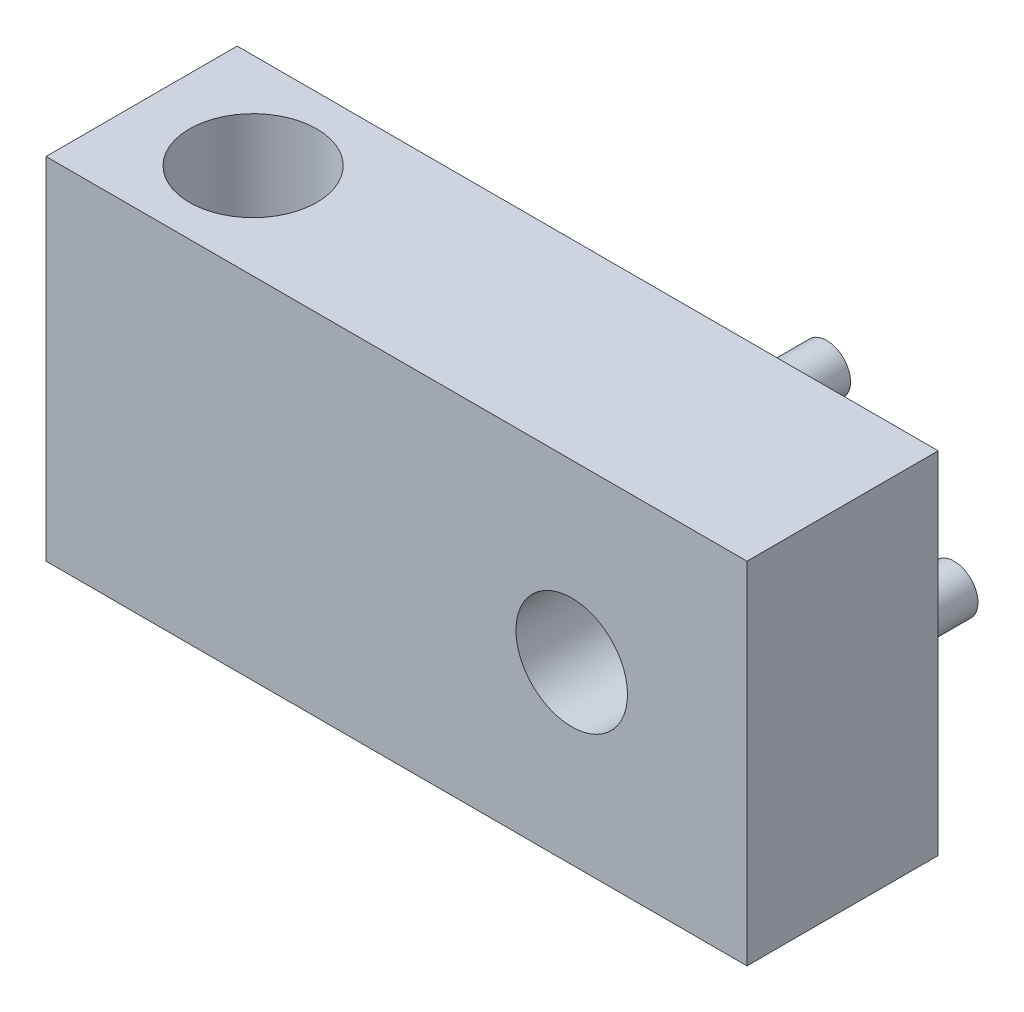
ISO-10303-21;
HEADER;
FILE_DESCRIPTION(('STEP AP214'),'2;1');
FILE_NAME('part.step','',(''),(''),'','','');
FILE_SCHEMA(('AUTOMOTIVE_DESIGN { 1 0 10303 214 1 1 1 1 }'));
ENDSEC;
DATA;
#1=APPLICATION_CONTEXT('core data for automotive mechanical design processes');
#2=APPLICATION_PROTOCOL_DEFINITION('international standard','automotive_design',2000,#1);
#3=PRODUCT_CONTEXT('',#1,'mechanical');
#4=PRODUCT('Part','Part','',(#3));
#5=PRODUCT_RELATED_PRODUCT_CATEGORY('part','',(#4));
#6=PRODUCT_DEFINITION_FORMATION('','',#4);
#7=PRODUCT_DEFINITION_CONTEXT('part definition',#1,'design');
#8=PRODUCT_DEFINITION('design','',#6,#7);
#9=PRODUCT_DEFINITION_SHAPE('','',#8);
#10=(LENGTH_UNIT() NAMED_UNIT(*) SI_UNIT(.MILLI.,.METRE.));
#11=(NAMED_UNIT(*) PLANE_ANGLE_UNIT() SI_UNIT($,.RADIAN.));
#12=(NAMED_UNIT(*) SI_UNIT($,.STERADIAN.) SOLID_ANGLE_UNIT());
#13=UNCERTAINTY_MEASURE_WITH_UNIT(LENGTH_MEASURE(1.E-05),#10,'distance_accuracy_value','');
#14=(GEOMETRIC_REPRESENTATION_CONTEXT(3) GLOBAL_UNCERTAINTY_ASSIGNED_CONTEXT((#13)) GLOBAL_UNIT_ASSIGNED_CONTEXT((#10,
#11,#12)) REPRESENTATION_CONTEXT('',''));
#15=CARTESIAN_POINT('',(0.,0.,0.));
#16=DIRECTION('',(0.,0.,1.));
#17=DIRECTION('',(1.,0.,0.));
#18=AXIS2_PLACEMENT_3D('',#15,#16,#17);
#19=CARTESIAN_POINT('',(11.,11.,12.));
#20=DIRECTION('',(-1.,0.,0.));
#21=DIRECTION('',(0.,-1.,0.));
#22=AXIS2_PLACEMENT_3D('',#19,#20,#21);
#23=PLANE('',#22);
#24=DIRECTION('',(0.,1.,0.));
#25=VECTOR('',#24,1.);
#26=CARTESIAN_POINT('',(11.,11.,0.));
#27=LINE('',#26,#25);
#28=CARTESIAN_POINT('',(11.,-11.,0.));
#29=VERTEX_POINT('',#28);
#30=CARTESIAN_POINT('',(11.,11.,0.));
#31=VERTEX_POINT('',#30);
#32=EDGE_CURVE('E85',#29,#31,#27,.T.);
#33=ORIENTED_EDGE('',*,*,#32,.T.);
#34=DIRECTION('',(0.,0.,-1.));
#35=VECTOR('',#34,1.);
#36=CARTESIAN_POINT('',(11.,11.,12.));
#37=LINE('',#36,#35);
#38=CARTESIAN_POINT('',(11.,11.,12.));
#39=VERTEX_POINT('',#38);
#40=EDGE_CURVE('E82',#39,#31,#37,.T.);
#41=ORIENTED_EDGE('',*,*,#40,.F.);
#42=DIRECTION('',(0.,1.,0.));
#43=VECTOR('',#42,1.);
#44=CARTESIAN_POINT('',(11.,11.,12.));
#45=LINE('',#44,#43);
#46=CARTESIAN_POINT('',(11.,-11.,12.));
#47=VERTEX_POINT('',#46);
#48=EDGE_CURVE('E124',#47,#39,#45,.T.);
#49=ORIENTED_EDGE('',*,*,#48,.F.);
#50=DIRECTION('',(0.,0.,-1.));
#51=VECTOR('',#50,1.);
#52=CARTESIAN_POINT('',(11.,-11.,12.));
#53=LINE('',#52,#51);
#54=EDGE_CURVE('E128',#47,#29,#53,.T.);
#55=ORIENTED_EDGE('',*,*,#54,.T.);
#56=EDGE_LOOP('',(#33,#41,#49,#55));
#57=FACE_BOUND('',#56,.T.);
#58=ADVANCED_FACE('F35',(#57),#23,.F.);
#59=CARTESIAN_POINT('',(-11.,11.,12.));
#60=DIRECTION('',(0.,-1.,0.));
#61=DIRECTION('',(0.,0.,-1.));
#62=AXIS2_PLACEMENT_3D('',#59,#60,#61);
#63=PLANE('',#62);
#64=CARTESIAN_POINT('',(-26.,11.,6.));
#65=DIRECTION('',(0.,-1.,0.));
#66=DIRECTION('',(0.,0.,-1.));
#67=AXIS2_PLACEMENT_3D('',#64,#65,#66);
#68=CIRCLE('',#67,4.);
#69=CARTESIAN_POINT('',(-26.,11.,2.));
#70=VERTEX_POINT('',#69);
#71=EDGE_CURVE('E97',#70,#70,#68,.T.);
#72=ORIENTED_EDGE('',*,*,#71,.T.);
#73=EDGE_LOOP('',(#72));
#74=FACE_BOUND('',#73,.T.);
#75=DIRECTION('',(-1.,0.,0.));
#76=VECTOR('',#75,1.);
#77=CARTESIAN_POINT('',(-11.,11.,0.));
#78=LINE('',#77,#76);
#79=CARTESIAN_POINT('',(-33.,11.,0.));
#80=VERTEX_POINT('',#79);
#81=EDGE_CURVE('E63',#31,#80,#78,.T.);
#82=ORIENTED_EDGE('',*,*,#81,.T.);
#83=DIRECTION('',(0.,0.,-1.));
#84=VECTOR('',#83,1.);
#85=CARTESIAN_POINT('',(-33.,11.,12.));
#86=LINE('',#85,#84);
#87=CARTESIAN_POINT('',(-33.,11.,12.));
#88=VERTEX_POINT('',#87);
#89=EDGE_CURVE('E80',#88,#80,#86,.T.);
#90=ORIENTED_EDGE('',*,*,#89,.F.);
#91=DIRECTION('',(-1.,0.,0.));
#92=VECTOR('',#91,1.);
#93=CARTESIAN_POINT('',(-11.,11.,12.));
#94=LINE('',#93,#92);
#95=EDGE_CURVE('E68',#39,#88,#94,.T.);
#96=ORIENTED_EDGE('',*,*,#95,.F.);
#97=ORIENTED_EDGE('',*,*,#40,.T.);
#98=EDGE_LOOP('',(#82,#90,#96,#97));
#99=FACE_BOUND('',#98,.T.);
#100=ADVANCED_FACE('F78',(#74,#99),#63,.F.);
#101=CARTESIAN_POINT('',(-11.,-11.,12.));
#102=DIRECTION('',(0.,1.,0.));
#103=DIRECTION('',(0.,0.,1.));
#104=AXIS2_PLACEMENT_3D('',#101,#102,#103);
#105=PLANE('',#104);
#106=CARTESIAN_POINT('',(-26.,-11.,6.));
#107=DIRECTION('',(0.,-1.,0.));
#108=DIRECTION('',(0.,0.,-1.));
#109=AXIS2_PLACEMENT_3D('',#106,#107,#108);
#110=CIRCLE('',#109,4.);
#111=CARTESIAN_POINT('',(-26.,-11.,2.));
#112=VERTEX_POINT('',#111);
#113=EDGE_CURVE('E100',#112,#112,#110,.T.);
#114=ORIENTED_EDGE('',*,*,#113,.F.);
#115=EDGE_LOOP('',(#114));
#116=FACE_BOUND('',#115,.T.);
#117=DIRECTION('',(1.,0.,0.));
#118=VECTOR('',#117,1.);
#119=CARTESIAN_POINT('',(-11.,-11.,0.));
#120=LINE('',#119,#118);
#121=CARTESIAN_POINT('',(-33.,-11.,0.));
#122=VERTEX_POINT('',#121);
#123=EDGE_CURVE('E84',#122,#29,#120,.T.);
#124=ORIENTED_EDGE('',*,*,#123,.T.);
#125=ORIENTED_EDGE('',*,*,#54,.F.);
#126=DIRECTION('',(1.,0.,0.));
#127=VECTOR('',#126,1.);
#128=CARTESIAN_POINT('',(-11.,-11.,12.));
#129=LINE('',#128,#127);
#130=CARTESIAN_POINT('',(-33.,-11.,12.));
#131=VERTEX_POINT('',#130);
#132=EDGE_CURVE('E51',#131,#47,#129,.T.);
#133=ORIENTED_EDGE('',*,*,#132,.F.);
#134=DIRECTION('',(0.,0.,1.));
#135=VECTOR('',#134,1.);
#136=CARTESIAN_POINT('',(-33.,-11.,0.));
#137=LINE('',#136,#135);
#138=EDGE_CURVE('E93',#122,#131,#137,.T.);
#139=ORIENTED_EDGE('',*,*,#138,.F.);
#140=EDGE_LOOP('',(#124,#125,#133,#139));
#141=FACE_BOUND('',#140,.T.);
#142=ADVANCED_FACE('F163',(#116,#141),#105,.F.);
#143=CARTESIAN_POINT('',(0.,0.,12.));
#144=DIRECTION('',(0.,0.,1.));
#145=DIRECTION('',(1.,0.,0.));
#146=AXIS2_PLACEMENT_3D('',#143,#144,#145);
#147=PLANE('',#146);
#148=CARTESIAN_POINT('',(0.,0.,12.));
#149=DIRECTION('',(0.,0.,1.));
#150=DIRECTION('',(1.,0.,0.));
#151=AXIS2_PLACEMENT_3D('',#148,#149,#150);
#152=CIRCLE('',#151,3.5);
#153=CARTESIAN_POINT('',(3.5,0.,12.));
#154=VERTEX_POINT('',#153);
#155=EDGE_CURVE('E118',#154,#154,#152,.T.);
#156=ORIENTED_EDGE('',*,*,#155,.F.);
#157=EDGE_LOOP('',(#156));
#158=FACE_BOUND('',#157,.T.);
#159=ORIENTED_EDGE('',*,*,#48,.T.);
#160=ORIENTED_EDGE('',*,*,#95,.T.);
#161=DIRECTION('',(0.,1.,0.));
#162=VECTOR('',#161,1.);
#163=CARTESIAN_POINT('',(-33.,-11.,12.));
#164=LINE('',#163,#162);
#165=EDGE_CURVE('E96',#131,#88,#164,.T.);
#166=ORIENTED_EDGE('',*,*,#165,.F.);
#167=ORIENTED_EDGE('',*,*,#132,.T.);
#168=EDGE_LOOP('',(#159,#160,#166,#167));
#169=FACE_BOUND('',#168,.T.);
#170=ADVANCED_FACE('F147',(#158,#169),#147,.T.);
#171=CARTESIAN_POINT('',(0.,0.,0.));
#172=DIRECTION('',(0.,0.,1.));
#173=DIRECTION('',(1.,0.,0.));
#174=AXIS2_PLACEMENT_3D('',#171,#172,#173);
#175=PLANE('',#174);
#176=CARTESIAN_POINT('',(7.99999999999977,-2.27373675443232E-13,0.));
#177=DIRECTION('',(0.,0.,1.));
#178=DIRECTION('',(1.,0.,0.));
#179=AXIS2_PLACEMENT_3D('',#176,#177,#178);
#180=CIRCLE('',#179,1.50000000000036);
#181=CARTESIAN_POINT('',(9.50000000000014,-2.27373675443232E-13,0.));
#182=VERTEX_POINT('',#181);
#183=EDGE_CURVE('E11',#182,#182,#180,.F.);
#184=ORIENTED_EDGE('',*,*,#183,.F.);
#185=EDGE_LOOP('',(#184));
#186=FACE_BOUND('',#185,.T.);
#187=CARTESIAN_POINT('',(-4.52787916007828E-13,-8.,0.));
#188=DIRECTION('',(0.,0.,1.));
#189=DIRECTION('',(1.,0.,0.));
#190=AXIS2_PLACEMENT_3D('',#187,#188,#189);
#191=CIRCLE('',#190,1.50000000000049);
#192=CARTESIAN_POINT('',(1.50000000000003,-8.,0.));
#193=VERTEX_POINT('',#192);
#194=EDGE_CURVE('E43',#193,#193,#191,.F.);
#195=ORIENTED_EDGE('',*,*,#194,.F.);
#196=EDGE_LOOP('',(#195));
#197=FACE_BOUND('',#196,.T.);
#198=CARTESIAN_POINT('',(-8.00000000000023,2.26393958003914E-13,0.));
#199=DIRECTION('',(0.,0.,1.));
#200=DIRECTION('',(1.,0.,0.));
#201=AXIS2_PLACEMENT_3D('',#198,#199,#200);
#202=CIRCLE('',#201,1.50000000000018);
#203=CARTESIAN_POINT('',(-6.50000000000005,2.26393958003914E-13,0.));
#204=VERTEX_POINT('',#203);
#205=EDGE_CURVE('E137',#204,#204,#202,.F.);
#206=ORIENTED_EDGE('',*,*,#205,.F.);
#207=EDGE_LOOP('',(#206));
#208=FACE_BOUND('',#207,.T.);
#209=CARTESIAN_POINT('',(0.,8.,0.));
#210=DIRECTION('',(0.,0.,1.));
#211=DIRECTION('',(1.,0.,0.));
#212=AXIS2_PLACEMENT_3D('',#209,#210,#211);
#213=CIRCLE('',#212,1.5);
#214=CARTESIAN_POINT('',(1.5,8.,0.));
#215=VERTEX_POINT('',#214);
#216=EDGE_CURVE('E134',#215,#215,#213,.F.);
#217=ORIENTED_EDGE('',*,*,#216,.F.);
#218=EDGE_LOOP('',(#217));
#219=FACE_BOUND('',#218,.T.);
#220=CARTESIAN_POINT('',(0.,0.,0.));
#221=DIRECTION('',(0.,0.,1.));
#222=DIRECTION('',(1.,0.,0.));
#223=AXIS2_PLACEMENT_3D('',#220,#221,#222);
#224=CIRCLE('',#223,3.5);
#225=CARTESIAN_POINT('',(3.5,0.,0.));
#226=VERTEX_POINT('',#225);
#227=EDGE_CURVE('E119',#226,#226,#224,.T.);
#228=ORIENTED_EDGE('',*,*,#227,.T.);
#229=EDGE_LOOP('',(#228));
#230=FACE_BOUND('',#229,.T.);
#231=ORIENTED_EDGE('',*,*,#32,.F.);
#232=ORIENTED_EDGE('',*,*,#123,.F.);
#233=DIRECTION('',(0.,-1.,0.));
#234=VECTOR('',#233,1.);
#235=CARTESIAN_POINT('',(-33.,11.,0.));
#236=LINE('',#235,#234);
#237=EDGE_CURVE('E88',#80,#122,#236,.T.);
#238=ORIENTED_EDGE('',*,*,#237,.F.);
#239=ORIENTED_EDGE('',*,*,#81,.F.);
#240=EDGE_LOOP('',(#231,#232,#238,#239));
#241=FACE_BOUND('',#240,.T.);
#242=ADVANCED_FACE('F89',(#186,#197,#208,#219,#230,#241),#175,.F.);
#243=CARTESIAN_POINT('',(0.,0.,0.));
#244=DIRECTION('',(0.,0.,1.));
#245=DIRECTION('',(1.,0.,0.));
#246=AXIS2_PLACEMENT_3D('',#243,#244,#245);
#247=CYLINDRICAL_SURFACE('',#246,3.5);
#248=ORIENTED_EDGE('',*,*,#227,.F.);
#249=EDGE_LOOP('',(#248));
#250=FACE_BOUND('',#249,.T.);
#251=ORIENTED_EDGE('',*,*,#155,.T.);
#252=EDGE_LOOP('',(#251));
#253=FACE_BOUND('',#252,.T.);
#254=ADVANCED_FACE('F146',(#250,#253),#247,.F.);
#255=CARTESIAN_POINT('',(0.,8.,-4.));
#256=DIRECTION('',(0.,0.,1.));
#257=DIRECTION('',(1.,0.,0.));
#258=AXIS2_PLACEMENT_3D('',#255,#256,#257);
#259=CYLINDRICAL_SURFACE('',#258,1.5);
#260=CARTESIAN_POINT('',(0.,8.,-4.));
#261=DIRECTION('',(0.,0.,-1.));
#262=DIRECTION('',(-1.,0.,0.));
#263=AXIS2_PLACEMENT_3D('',#260,#261,#262);
#264=CIRCLE('',#263,1.5);
#265=CARTESIAN_POINT('',(-1.5,8.,-4.));
#266=VERTEX_POINT('',#265);
#267=EDGE_CURVE('E115',#266,#266,#264,.T.);
#268=ORIENTED_EDGE('',*,*,#267,.F.);
#269=EDGE_LOOP('',(#268));
#270=FACE_BOUND('',#269,.T.);
#271=ORIENTED_EDGE('',*,*,#216,.T.);
#272=EDGE_LOOP('',(#271));
#273=FACE_BOUND('',#272,.T.);
#274=ADVANCED_FACE('F158',(#270,#273),#259,.T.);
#275=CARTESIAN_POINT('',(0.,8.,-4.));
#276=DIRECTION('',(0.,0.,-1.));
#277=DIRECTION('',(-1.,0.,0.));
#278=AXIS2_PLACEMENT_3D('',#275,#276,#277);
#279=PLANE('',#278);
#280=ORIENTED_EDGE('',*,*,#267,.T.);
#281=EDGE_LOOP('',(#280));
#282=FACE_BOUND('',#281,.T.);
#283=ADVANCED_FACE('F257',(#282),#279,.T.);
#284=CARTESIAN_POINT('',(-8.00000000000023,2.26393958003914E-13,-4.));
#285=DIRECTION('',(0.,0.,1.));
#286=DIRECTION('',(1.,0.,0.));
#287=AXIS2_PLACEMENT_3D('',#284,#285,#286);
#288=CYLINDRICAL_SURFACE('',#287,1.50000000000018);
#289=CARTESIAN_POINT('',(-8.00000000000023,2.26393958003914E-13,-4.));
#290=DIRECTION('',(0.,0.,-1.));
#291=DIRECTION('',(-1.,0.,0.));
#292=AXIS2_PLACEMENT_3D('',#289,#290,#291);
#293=CIRCLE('',#292,1.50000000000018);
#294=CARTESIAN_POINT('',(-9.5000000000004,2.26393958003914E-13,-4.));
#295=VERTEX_POINT('',#294);
#296=EDGE_CURVE('E112',#295,#295,#293,.T.);
#297=ORIENTED_EDGE('',*,*,#296,.F.);
#298=EDGE_LOOP('',(#297));
#299=FACE_BOUND('',#298,.T.);
#300=ORIENTED_EDGE('',*,*,#205,.T.);
#301=EDGE_LOOP('',(#300));
#302=FACE_BOUND('',#301,.T.);
#303=ADVANCED_FACE('F249',(#299,#302),#288,.T.);
#304=CARTESIAN_POINT('',(-8.00000000000023,2.26393958003914E-13,-4.));
#305=DIRECTION('',(0.,0.,-1.));
#306=DIRECTION('',(-1.,0.,0.));
#307=AXIS2_PLACEMENT_3D('',#304,#305,#306);
#308=PLANE('',#307);
#309=ORIENTED_EDGE('',*,*,#296,.T.);
#310=EDGE_LOOP('',(#309));
#311=FACE_BOUND('',#310,.T.);
#312=ADVANCED_FACE('F241',(#311),#308,.T.);
#313=CARTESIAN_POINT('',(-4.52787916007828E-13,-8.,-4.));
#314=DIRECTION('',(0.,0.,1.));
#315=DIRECTION('',(1.,0.,0.));
#316=AXIS2_PLACEMENT_3D('',#313,#314,#315);
#317=CYLINDRICAL_SURFACE('',#316,1.50000000000049);
#318=CARTESIAN_POINT('',(-4.52787916007828E-13,-8.,-4.));
#319=DIRECTION('',(0.,0.,-1.));
#320=DIRECTION('',(-1.,0.,0.));
#321=AXIS2_PLACEMENT_3D('',#318,#319,#320);
#322=CIRCLE('',#321,1.50000000000049);
#323=CARTESIAN_POINT('',(-1.50000000000094,-8.,-4.));
#324=VERTEX_POINT('',#323);
#325=EDGE_CURVE('E109',#324,#324,#322,.T.);
#326=ORIENTED_EDGE('',*,*,#325,.F.);
#327=EDGE_LOOP('',(#326));
#328=FACE_BOUND('',#327,.T.);
#329=ORIENTED_EDGE('',*,*,#194,.T.);
#330=EDGE_LOOP('',(#329));
#331=FACE_BOUND('',#330,.T.);
#332=ADVANCED_FACE('F142',(#328,#331),#317,.T.);
#333=CARTESIAN_POINT('',(-4.52787916007828E-13,-8.,-4.));
#334=DIRECTION('',(0.,0.,-1.));
#335=DIRECTION('',(-1.,0.,0.));
#336=AXIS2_PLACEMENT_3D('',#333,#334,#335);
#337=PLANE('',#336);
#338=ORIENTED_EDGE('',*,*,#325,.T.);
#339=EDGE_LOOP('',(#338));
#340=FACE_BOUND('',#339,.T.);
#341=ADVANCED_FACE('F226',(#340),#337,.T.);
#342=CARTESIAN_POINT('',(7.99999999999977,-2.27373675443232E-13,-4.));
#343=DIRECTION('',(0.,0.,1.));
#344=DIRECTION('',(1.,0.,0.));
#345=AXIS2_PLACEMENT_3D('',#342,#343,#344);
#346=CYLINDRICAL_SURFACE('',#345,1.50000000000036);
#347=CARTESIAN_POINT('',(7.99999999999977,-2.27373675443232E-13,-4.));
#348=DIRECTION('',(0.,0.,-1.));
#349=DIRECTION('',(-1.,0.,0.));
#350=AXIS2_PLACEMENT_3D('',#347,#348,#349);
#351=CIRCLE('',#350,1.50000000000036);
#352=CARTESIAN_POINT('',(6.49999999999941,-2.27373675443232E-13,-4.));
#353=VERTEX_POINT('',#352);
#354=EDGE_CURVE('E106',#353,#353,#351,.T.);
#355=ORIENTED_EDGE('',*,*,#354,.F.);
#356=EDGE_LOOP('',(#355));
#357=FACE_BOUND('',#356,.T.);
#358=ORIENTED_EDGE('',*,*,#183,.T.);
#359=EDGE_LOOP('',(#358));
#360=FACE_BOUND('',#359,.T.);
#361=ADVANCED_FACE('F218',(#357,#360),#346,.T.);
#362=CARTESIAN_POINT('',(7.99999999999977,-2.27373675443232E-13,-4.));
#363=DIRECTION('',(0.,0.,-1.));
#364=DIRECTION('',(-1.,0.,0.));
#365=AXIS2_PLACEMENT_3D('',#362,#363,#364);
#366=PLANE('',#365);
#367=ORIENTED_EDGE('',*,*,#354,.T.);
#368=EDGE_LOOP('',(#367));
#369=FACE_BOUND('',#368,.T.);
#370=ADVANCED_FACE('F213',(#369),#366,.T.);
#371=CARTESIAN_POINT('',(-33.,0.,0.));
#372=DIRECTION('',(-1.,0.,0.));
#373=DIRECTION('',(0.,-1.,0.));
#374=AXIS2_PLACEMENT_3D('',#371,#372,#373);
#375=PLANE('',#374);
#376=ORIENTED_EDGE('',*,*,#89,.T.);
#377=ORIENTED_EDGE('',*,*,#237,.T.);
#378=ORIENTED_EDGE('',*,*,#138,.T.);
#379=ORIENTED_EDGE('',*,*,#165,.T.);
#380=EDGE_LOOP('',(#376,#377,#378,#379));
#381=FACE_BOUND('',#380,.T.);
#382=ADVANCED_FACE('F95',(#381),#375,.T.);
#383=CARTESIAN_POINT('',(-26.,11.,6.));
#384=DIRECTION('',(0.,-1.,0.));
#385=DIRECTION('',(0.,0.,-1.));
#386=AXIS2_PLACEMENT_3D('',#383,#384,#385);
#387=CYLINDRICAL_SURFACE('',#386,4.);
#388=ORIENTED_EDGE('',*,*,#71,.F.);
#389=EDGE_LOOP('',(#388));
#390=FACE_BOUND('',#389,.T.);
#391=ORIENTED_EDGE('',*,*,#113,.T.);
#392=EDGE_LOOP('',(#391));
#393=FACE_BOUND('',#392,.T.);
#394=ADVANCED_FACE('F202',(#390,#393),#387,.F.);
#395=CLOSED_SHELL('',(#58,#100,#142,#170,#242,#254,#274,#283,#303,#312,#332,#341,#361,#370,#382,#394));
#396=MANIFOLD_SOLID_BREP('B2',#395);
#397=ADVANCED_BREP_SHAPE_REPRESENTATION('',(#18,#396),#14);
#398=SHAPE_DEFINITION_REPRESENTATION(#9,#397);
ENDSEC;
END-ISO-10303-21;
